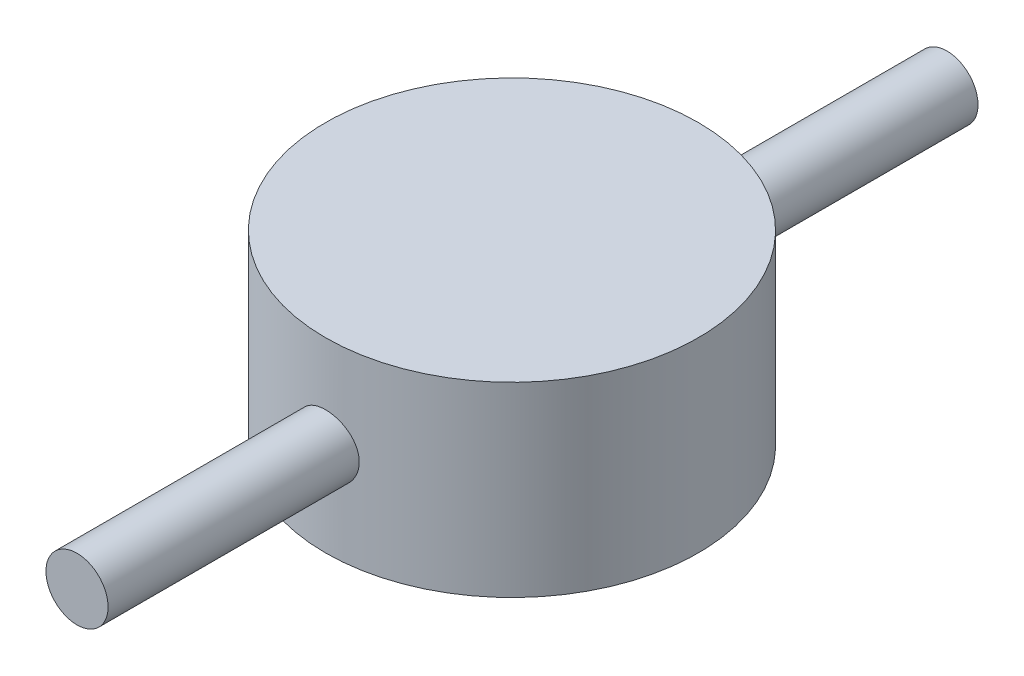
ISO-10303-21;
HEADER;
FILE_DESCRIPTION(('STEP AP214'),'2;1');
FILE_NAME('part.step','',(''),(''),'','','');
FILE_SCHEMA(('AUTOMOTIVE_DESIGN { 1 0 10303 214 1 1 1 1 }'));
ENDSEC;
DATA;
#1=APPLICATION_CONTEXT('core data for automotive mechanical design processes');
#2=APPLICATION_PROTOCOL_DEFINITION('international standard','automotive_design',2000,#1);
#3=PRODUCT_CONTEXT('',#1,'mechanical');
#4=PRODUCT('Part','Part','',(#3));
#5=PRODUCT_RELATED_PRODUCT_CATEGORY('part','',(#4));
#6=PRODUCT_DEFINITION_FORMATION('','',#4);
#7=PRODUCT_DEFINITION_CONTEXT('part definition',#1,'design');
#8=PRODUCT_DEFINITION('design','',#6,#7);
#9=PRODUCT_DEFINITION_SHAPE('','',#8);
#10=(LENGTH_UNIT() NAMED_UNIT(*) SI_UNIT(.MILLI.,.METRE.));
#11=(NAMED_UNIT(*) PLANE_ANGLE_UNIT() SI_UNIT($,.RADIAN.));
#12=(NAMED_UNIT(*) SI_UNIT($,.STERADIAN.) SOLID_ANGLE_UNIT());
#13=UNCERTAINTY_MEASURE_WITH_UNIT(LENGTH_MEASURE(1.E-05),#10,'distance_accuracy_value','');
#14=(GEOMETRIC_REPRESENTATION_CONTEXT(3) GLOBAL_UNCERTAINTY_ASSIGNED_CONTEXT((#13)) GLOBAL_UNIT_ASSIGNED_CONTEXT((#10,
#11,#12)) REPRESENTATION_CONTEXT('',''));
#15=CARTESIAN_POINT('',(0.,0.,0.));
#16=DIRECTION('',(0.,0.,1.));
#17=DIRECTION('',(1.,0.,0.));
#18=AXIS2_PLACEMENT_3D('',#15,#16,#17);
#19=CARTESIAN_POINT('',(0.,15.,0.));
#20=DIRECTION('',(0.,-1.,0.));
#21=DIRECTION('',(0.,0.,-1.));
#22=AXIS2_PLACEMENT_3D('',#19,#20,#21);
#23=CYLINDRICAL_SURFACE('',#22,15.);
#24=CARTESIAN_POINT('',(0.,9.98457309762614,-15.));
#25=CARTESIAN_POINT('',(-0.139390904958215,9.98456750867832,-14.9999976116882));
#26=CARTESIAN_POINT('',(-0.278857881838821,9.97287582265722,-14.9980367791303));
#27=CARTESIAN_POINT('',(-0.553880221673043,9.92643743886082,-14.9904034494139));
#28=CARTESIAN_POINT('',(-0.689431867959247,9.89166954071454,-14.9847275392389));
#29=CARTESIAN_POINT('',(-0.952604747212645,9.80015764903339,-14.9703006823645));
#30=CARTESIAN_POINT('',(-1.0802323684319,9.74343163198557,-14.9615522515919));
#31=CARTESIAN_POINT('',(-1.32414184197795,9.60966080557375,-14.9419422708207));
#32=CARTESIAN_POINT('',(-1.44042498987859,9.53261832014314,-14.9310809625443));
#33=CARTESIAN_POINT('',(-1.65947261429168,9.35961801380568,-14.9083331745831));
#34=CARTESIAN_POINT('',(-1.76211290353497,9.26350398299001,-14.8964387181486));
#35=CARTESIAN_POINT('',(-1.94988849865993,9.05542512915333,-14.8730262687673));
#36=CARTESIAN_POINT('',(-2.03502269939097,8.94345930616953,-14.8615082996267));
#37=CARTESIAN_POINT('',(-2.18586712560513,8.70600213142909,-14.8400756575978));
#38=CARTESIAN_POINT('',(-2.251454552861,8.58043176082139,-14.8301712909164));
#39=CARTESIAN_POINT('',(-2.36055836541122,8.31986353332552,-14.8131978979467));
#40=CARTESIAN_POINT('',(-2.40407624156561,8.18486631394851,-14.8061286801431));
#41=CARTESIAN_POINT('',(-2.46741437778481,7.9105928227696,-14.7957053684276));
#42=CARTESIAN_POINT('',(-2.4874490291354,7.77136736112475,-14.792317684857));
#43=CARTESIAN_POINT('',(-2.50391672528988,7.49149282074267,-14.7895393893665));
#44=CARTESIAN_POINT('',(-2.500351440389,7.35084384345884,-14.7901484945721));
#45=CARTESIAN_POINT('',(-2.46989509839615,7.07364523635069,-14.7952642886356));
#46=CARTESIAN_POINT('',(-2.44324488188977,6.93706829408091,-14.7997307331892));
#47=CARTESIAN_POINT('',(-2.36775314040344,6.67035177979701,-14.8119949521101));
#48=CARTESIAN_POINT('',(-2.31891085431974,6.5402124287376,-14.8197928407327));
#49=CARTESIAN_POINT('',(-2.20017724609391,6.28934427418522,-14.837884793341));
#50=CARTESIAN_POINT('',(-2.13018591387971,6.16866369154491,-14.8481906710733));
#51=CARTESIAN_POINT('',(-1.97121201755743,5.94066869708776,-14.8701291841501));
#52=CARTESIAN_POINT('',(-1.88222792065429,5.83335536517121,-14.8817619265429));
#53=CARTESIAN_POINT('',(-1.68648221215905,5.63374701181879,-14.9052202787979));
#54=CARTESIAN_POINT('',(-1.57951396387313,5.54165457908606,-14.9170464923165));
#55=CARTESIAN_POINT('',(-1.35153524898165,5.3766953349608,-14.9394260139672));
#56=CARTESIAN_POINT('',(-1.23052469190642,5.30382864744291,-14.9499793138975));
#57=CARTESIAN_POINT('',(-0.977705916166711,5.17937087048986,-14.9686389289291));
#58=CARTESIAN_POINT('',(-0.84588872556466,5.12779767829488,-14.9767431840745));
#59=CARTESIAN_POINT('',(-0.57529834560273,5.04757888238016,-14.9895750301266));
#60=CARTESIAN_POINT('',(-0.436525739179467,5.01893136065242,-14.9943029035047));
#61=CARTESIAN_POINT('',(-0.157709901301623,4.98565173916501,-14.9998112984269));
#62=CARTESIAN_POINT('',(-0.0177007371510108,4.98074152582053,-15.0006375301278));
#63=CARTESIAN_POINT('',(0.261139772889888,4.99433444205426,-14.9983747442117));
#64=CARTESIAN_POINT('',(0.399971163892039,5.01283667075988,-14.9952858772412));
#65=CARTESIAN_POINT('',(0.671656175546764,5.07249794696162,-14.985568269382));
#66=CARTESIAN_POINT('',(0.804540868385379,5.11351930601627,-14.9789610480131));
#67=CARTESIAN_POINT('',(1.06154688486044,5.21690761582567,-14.9629446445536));
#68=CARTESIAN_POINT('',(1.18566771590972,5.27927576526141,-14.9535353051202));
#69=CARTESIAN_POINT('',(1.42283068946896,5.42422422232293,-14.9328451630241));
#70=CARTESIAN_POINT('',(1.53576525093715,5.50697825379339,-14.9215485588702));
#71=CARTESIAN_POINT('',(1.74624358550269,5.6901104130112,-14.898384673919));
#72=CARTESIAN_POINT('',(1.84378623969658,5.79048982090281,-14.8865173517155));
#73=CARTESIAN_POINT('',(2.021742779658,6.00727064569756,-14.8634017523585));
#74=CARTESIAN_POINT('',(2.10196876111372,6.12382726314055,-14.8521611613711));
#75=CARTESIAN_POINT('',(2.24170231029499,6.36892606676468,-14.8317152977788));
#76=CARTESIAN_POINT('',(2.30121053476982,6.49746787285364,-14.8225099606602));
#77=CARTESIAN_POINT('',(2.39753833147315,6.76236283043827,-14.807234536977));
#78=CARTESIAN_POINT('',(2.43445143254795,6.89868119265663,-14.8011515431106));
#79=CARTESIAN_POINT('',(2.48483545377828,7.1756932268479,-14.7927771683526));
#80=CARTESIAN_POINT('',(2.49830841194617,7.3163865173582,-14.7904854578272));
#81=CARTESIAN_POINT('',(2.50137286604735,7.59627826358855,-14.7899673308401));
#82=CARTESIAN_POINT('',(2.49126013612519,7.73547347620143,-14.7916905650565));
#83=CARTESIAN_POINT('',(2.44807983895685,8.01015234567691,-14.7988978145373));
#84=CARTESIAN_POINT('',(2.41501234611248,8.14563601456801,-14.8043818176121));
#85=CARTESIAN_POINT('',(2.3269744895949,8.40893153491876,-14.8184735628172));
#86=CARTESIAN_POINT('',(2.27202959060044,8.53675210768217,-14.8270776721967));
#87=CARTESIAN_POINT('',(2.14182700391591,8.78140876682099,-14.8464436892221));
#88=CARTESIAN_POINT('',(2.06656830874856,8.89824430799828,-14.857205703884));
#89=CARTESIAN_POINT('',(1.89681888437215,9.11910868073389,-14.8798345404562));
#90=CARTESIAN_POINT('',(1.80211056359365,9.22296911432642,-14.891712955763));
#91=CARTESIAN_POINT('',(1.59660903138023,9.41342470210108,-14.9151437236084));
#92=CARTESIAN_POINT('',(1.48581211291264,9.50001586626431,-14.9266960002655));
#93=CARTESIAN_POINT('',(1.25036916964028,9.65402136582609,-14.9482652964222));
#94=CARTESIAN_POINT('',(1.12563278753282,9.72129913693909,-14.958271162531));
#95=CARTESIAN_POINT('',(0.86651306937898,9.83384258223606,-14.9755116760178));
#96=CARTESIAN_POINT('',(0.732139494830009,9.87913017870584,-14.9827490817748));
#97=CARTESIAN_POINT('',(0.4977033100454,9.93657837175281,-14.9920579083296));
#98=CARTESIAN_POINT('',(0.399058830298446,9.95454756724211,-14.9950202727336));
#99=CARTESIAN_POINT('',(0.200289310319809,9.97854683547089,-14.9989921598612));
#100=CARTESIAN_POINT('',(0.100164295608494,9.9845771137635,-15.0000017162064));
#101=CARTESIAN_POINT('',(0.,9.98457309762614,-15.));
#102=B_SPLINE_CURVE_WITH_KNOTS('',3,(#24,#25,#26,#27,#28,#29,#30,#31,#32,#33,#34,#35,#36,#37,
#38,#39,#40,#41,#42,#43,#44,#45,#46,#47,#48,#49,#50,#51,#52,#53,#54,#55,#56,#57,#58,#59,#60,#61,
#62,#63,#64,#65,#66,#67,#68,#69,#70,#71,#72,#73,#74,#75,#76,#77,#78,#79,#80,#81,#82,#83,#84,#85,
#86,#87,#88,#89,#90,#91,#92,#93,#94,#95,#96,#97,#98,#99,#100,#101),.UNSPECIFIED.,.T.,.F.,(4,2,2,
2,2,2,2,2,2,2,2,2,2,2,2,2,2,2,2,2,2,2,2,2,2,2,2,2,2,2,2,2,2,2,2,2,2,2,4),(0.,0.41780658493851,
0.835997545695421,1.25384686702527,1.67164841267479,2.09302491062332,2.51442800169857,
2.9384252082384,3.36239376876181,3.78246077103424,4.20249804320886,4.61820521760409,
5.03392665025381,5.45164556632558,5.86939820680574,6.29232769911327,6.71525991635848,
7.13854688915904,7.56179844521149,7.98007883491397,8.3983431303586,8.81407807006416,
9.22983635826067,9.64926825627024,10.0687306305428,10.4925382200762,10.9163323737594,
11.3383602234177,11.7603513778662,12.177079095227,12.5938054618813,13.0100481822622,
13.4263115502934,13.8475138419339,14.2688133387897,14.693022316072,15.1168075213007,
15.4170424816402,15.7172722727697),.UNSPECIFIED.);
#103=CARTESIAN_POINT('',(0.,9.98457309762614,-15.));
#104=VERTEX_POINT('',#103);
#105=EDGE_CURVE('E35',#104,#104,#102,.T.);
#106=ORIENTED_EDGE('',*,*,#105,.T.);
#107=EDGE_LOOP('',(#106));
#108=FACE_BOUND('',#107,.T.);
#109=CARTESIAN_POINT('',(2.5,7.48457309762614,14.790199457749));
#110=CARTESIAN_POINT('',(2.49999439841983,7.34519734946433,14.790201973666));
#111=CARTESIAN_POINT('',(2.48830516902828,7.20574549155467,14.7921909238523));
#112=CARTESIAN_POINT('',(2.44187742806638,6.93075455436297,14.7999245720004));
#113=CARTESIAN_POINT('',(2.40711766030861,6.79521920386808,14.8056727334637));
#114=CARTESIAN_POINT('',(2.31562954367049,6.53208081428453,14.8202560936731));
#115=CARTESIAN_POINT('',(2.25891955493199,6.40447124896389,14.8290887118401));
#116=CARTESIAN_POINT('',(2.12518649688947,6.16059214290837,14.8488427210228));
#117=CARTESIAN_POINT('',(2.04816571350133,6.04432132804881,14.8597638769423));
#118=CARTESIAN_POINT('',(1.87518752696654,5.82526024788158,14.8825847115588));
#119=CARTESIAN_POINT('',(1.77906904893234,5.72259796623992,14.8944921732795));
#120=CARTESIAN_POINT('',(1.57097200469527,5.53477979076433,14.9178748066858));
#121=CARTESIAN_POINT('',(1.45899249914997,5.44962493451072,14.9293499527174));
#122=CARTESIAN_POINT('',(1.22152286994836,5.29875853040687,14.9506573698271));
#123=CARTESIAN_POINT('',(1.09595608145671,5.23316608989434,14.9604794243234));
#124=CARTESIAN_POINT('',(0.835395621723868,5.12405202709559,14.9772873695709));
#125=CARTESIAN_POINT('',(0.700402564078188,5.08052896974126,14.9842734447266));
#126=CARTESIAN_POINT('',(0.426143726344242,5.01718056264224,14.994567347244));
#127=CARTESIAN_POINT('',(0.286928886679271,4.99714018162145,14.9979085311091));
#128=CARTESIAN_POINT('',(0.00707528552579717,4.98065734347354,15.0006507934278));
#129=CARTESIAN_POINT('',(-0.133563378528898,4.98421328237891,15.0000521396931));
#130=CARTESIAN_POINT('',(-0.410802185078876,5.01465444915435,14.9950085843139));
#131=CARTESIAN_POINT('',(-0.547428530700141,5.04130826103529,14.990601836924));
#132=CARTESIAN_POINT('',(-0.814241979611791,5.11682417187263,14.9784797877164));
#133=CARTESIAN_POINT('',(-0.944428886651504,5.16568694721564,14.9707643851321));
#134=CARTESIAN_POINT('',(-1.19535614778265,5.28446373794146,14.9528269851196));
#135=CARTESIAN_POINT('',(-1.31605052301904,5.35447310970858,14.9425936732688));
#136=CARTESIAN_POINT('',(-1.54406552984664,5.51348592026119,14.920757380715));
#137=CARTESIAN_POINT('',(-1.65138507791588,5.60249089633696,14.9091542891913));
#138=CARTESIAN_POINT('',(-1.85097127344667,5.79825190424545,14.885702682326));
#139=CARTESIAN_POINT('',(-1.94303950225321,5.90521019252712,14.8738528973104));
#140=CARTESIAN_POINT('',(-2.10795458844806,6.13316018784196,14.8513795978481));
#141=CARTESIAN_POINT('',(-2.18080126853242,6.25415202430896,14.8407560947132));
#142=CARTESIAN_POINT('',(-2.30524443448829,6.50696473950362,14.8219375456182));
#143=CARTESIAN_POINT('',(-2.35681702727924,6.63879759571823,14.813745233026));
#144=CARTESIAN_POINT('',(-2.43702987081562,6.90942216993369,14.8007618868988));
#145=CARTESIAN_POINT('',(-2.46567214076796,7.04821327405856,14.7959705538832));
#146=CARTESIAN_POINT('',(-2.49893188487927,7.32703925378827,14.7903895942212));
#147=CARTESIAN_POINT('',(-2.50383220791244,7.46703947732824,14.7895528575867));
#148=CARTESIAN_POINT('',(-2.49022270268246,7.74585976931696,14.7918503478236));
#149=CARTESIAN_POINT('',(-2.47171377862467,7.88467988314011,14.7949844213185));
#150=CARTESIAN_POINT('',(-2.4120523349281,8.156300856817,14.8048268745502));
#151=CARTESIAN_POINT('',(-2.37104379064639,8.28913423750415,14.8115125191835));
#152=CARTESIAN_POINT('',(-2.26769819019228,8.54604326390563,14.827685730055));
#153=CARTESIAN_POINT('',(-2.20535985810094,8.67011838517704,14.8371734639058));
#154=CARTESIAN_POINT('',(-2.06045667322923,8.90724769203225,14.8579912839739));
#155=CARTESIAN_POINT('',(-1.97771056415936,9.0201896703822,14.8693375560035));
#156=CARTESIAN_POINT('',(-1.79458946570798,9.23068663032115,14.8925466667987));
#157=CARTESIAN_POINT('',(-1.69421323638404,9.32824052873588,14.9044095418533));
#158=CARTESIAN_POINT('',(-1.47742807032881,9.50622499035484,14.9274642211826));
#159=CARTESIAN_POINT('',(-1.3608632533862,9.58646692391068,14.9386477634467));
#160=CARTESIAN_POINT('',(-1.11574344794933,9.72622842463102,14.9589511243294));
#161=CARTESIAN_POINT('',(-0.987188847470627,9.78574866209999,14.9680710096998));
#162=CARTESIAN_POINT('',(-0.722299051501328,9.88208368158101,14.9831835816958));
#163=CARTESIAN_POINT('',(-0.586000562602611,9.91899717336106,14.9891898456762));
#164=CARTESIAN_POINT('',(-0.309030734874211,9.96938869658997,14.9974558316928));
#165=CARTESIAN_POINT('',(-0.168359756821621,9.98286865635849,14.9997158620019));
#166=CARTESIAN_POINT('',(0.111541275773676,9.98595497993834,15.0002303788781));
#167=CARTESIAN_POINT('',(0.250768160602665,9.97584835156723,14.9985330202419));
#168=CARTESIAN_POINT('',(0.525511974314705,9.93266917535671,14.9914217838733));
#169=CARTESIAN_POINT('',(0.661028923967479,9.89959675611647,14.9860079269518));
#170=CARTESIAN_POINT('',(0.924396445918537,9.81153493208249,14.972069888274));
#171=CARTESIAN_POINT('',(1.05225537215382,9.75656992941609,14.9635491704088));
#172=CARTESIAN_POINT('',(1.29698045298217,9.62631516139556,14.9443275687803));
#173=CARTESIAN_POINT('',(1.41384608611822,9.55102443256369,14.9336265816741));
#174=CARTESIAN_POINT('',(1.63471294552639,9.38123800516564,14.9110762961641));
#175=CARTESIAN_POINT('',(1.73855143060275,9.28653214287489,14.8992152454112));
#176=CARTESIAN_POINT('',(1.92896387595091,9.08104478972233,14.8757630331437));
#177=CARTESIAN_POINT('',(2.0155337867119,8.97025953871361,14.8641719354951));
#178=CARTESIAN_POINT('',(2.16951427091086,8.73482777513652,14.8424834353391));
#179=CARTESIAN_POINT('',(2.2367849890577,8.61008875786066,14.8323971784578));
#180=CARTESIAN_POINT('',(2.34931453640427,8.35096386178799,14.8149921009131));
#181=CARTESIAN_POINT('',(2.39459535522307,8.21658777494878,14.8076705172488));
#182=CARTESIAN_POINT('',(2.45202605312742,7.98216932813876,14.7982474485649));
#183=CARTESIAN_POINT('',(2.46998741767139,7.88354628966353,14.7952462341947));
#184=CARTESIAN_POINT('',(2.49397629518131,7.6848196127892,14.7912213528807));
#185=CARTESIAN_POINT('',(2.50000402479277,7.58471600130194,14.7901976500369));
#186=CARTESIAN_POINT('',(2.5,7.48457309762614,14.790199457749));
#187=B_SPLINE_CURVE_WITH_KNOTS('',3,(#109,#110,#111,#112,#113,#114,#115,#116,#117,#118,#119,
#120,#121,#122,#123,#124,#125,#126,#127,#128,#129,#130,#131,#132,#133,#134,#135,#136,#137,#138,
#139,#140,#141,#142,#143,#144,#145,#146,#147,#148,#149,#150,#151,#152,#153,#154,#155,#156,#157,
#158,#159,#160,#161,#162,#163,#164,#165,#166,#167,#168,#169,#170,#171,#172,#173,#174,#175,#176,
#177,#178,#179,#180,#181,#182,#183,#184,#185,#186),.UNSPECIFIED.,.T.,.F.,(4,2,2,2,2,2,2,2,2,2,2,
2,2,2,2,2,2,2,2,2,2,2,2,2,2,2,2,2,2,2,2,2,2,2,2,2,2,2,4),(0.,0.41776103892774,0.83590751996297,
1.25370499787519,1.67145547405274,2.09289159155715,2.51435267834447,2.93832980111435,
3.36227935111113,3.78231567472565,4.20232344652692,4.61817121164668,5.03403164249533,
5.45179604139425,5.86959426226764,6.29246123462123,6.71533210746019,7.13867662498604,
7.56198385938077,7.98023542420411,8.39847083413976,8.81406064635492,9.22967532293575,
9.64912342762702,10.0686010443069,10.4924411303538,10.916267504767,11.3382298441765,
11.7601574591235,12.1769777626592,12.5937957321882,13.0101503983246,13.4265248039234,
13.8476699746325,14.2689137888181,14.6931372761832,15.1169356674445,15.4171067054377,
15.7172722940182),.UNSPECIFIED.);
#188=CARTESIAN_POINT('',(2.5,7.48457309762614,14.790199457749));
#189=VERTEX_POINT('',#188);
#190=EDGE_CURVE('E51',#189,#189,#187,.T.);
#191=ORIENTED_EDGE('',*,*,#190,.T.);
#192=EDGE_LOOP('',(#191));
#193=FACE_BOUND('',#192,.T.);
#194=CARTESIAN_POINT('',(0.,15.,0.));
#195=DIRECTION('',(0.,1.,0.));
#196=DIRECTION('',(0.,0.,1.));
#197=AXIS2_PLACEMENT_3D('',#194,#195,#196);
#198=CIRCLE('',#197,15.);
#199=CARTESIAN_POINT('',(0.,15.,15.));
#200=VERTEX_POINT('',#199);
#201=EDGE_CURVE('E10',#200,#200,#198,.T.);
#202=ORIENTED_EDGE('',*,*,#201,.F.);
#203=EDGE_LOOP('',(#202));
#204=FACE_BOUND('',#203,.T.);
#205=CARTESIAN_POINT('',(0.,0.,0.));
#206=DIRECTION('',(0.,1.,0.));
#207=DIRECTION('',(0.,0.,1.));
#208=AXIS2_PLACEMENT_3D('',#205,#206,#207);
#209=CIRCLE('',#208,15.);
#210=CARTESIAN_POINT('',(0.,0.,15.));
#211=VERTEX_POINT('',#210);
#212=EDGE_CURVE('E42',#211,#211,#209,.T.);
#213=ORIENTED_EDGE('',*,*,#212,.T.);
#214=EDGE_LOOP('',(#213));
#215=FACE_BOUND('',#214,.T.);
#216=ADVANCED_FACE('F31',(#108,#193,#204,#215),#23,.T.);
#217=CARTESIAN_POINT('',(0.,15.,0.));
#218=DIRECTION('',(0.,1.,0.));
#219=DIRECTION('',(0.,0.,1.));
#220=AXIS2_PLACEMENT_3D('',#217,#218,#219);
#221=PLANE('',#220);
#222=ORIENTED_EDGE('',*,*,#201,.T.);
#223=EDGE_LOOP('',(#222));
#224=FACE_BOUND('',#223,.T.);
#225=ADVANCED_FACE('F64',(#224),#221,.T.);
#226=CARTESIAN_POINT('',(0.,0.,0.));
#227=DIRECTION('',(0.,1.,0.));
#228=DIRECTION('',(0.,0.,1.));
#229=AXIS2_PLACEMENT_3D('',#226,#227,#228);
#230=PLANE('',#229);
#231=ORIENTED_EDGE('',*,*,#212,.F.);
#232=EDGE_LOOP('',(#231));
#233=FACE_BOUND('',#232,.T.);
#234=ADVANCED_FACE('F67',(#233),#230,.F.);
#235=CARTESIAN_POINT('',(0.,7.48457309762614,35.));
#236=DIRECTION('',(0.,0.,1.));
#237=DIRECTION('',(1.,0.,0.));
#238=AXIS2_PLACEMENT_3D('',#235,#236,#237);
#239=PLANE('',#238);
#240=CARTESIAN_POINT('',(0.,7.48457309762614,35.));
#241=DIRECTION('',(0.,0.,1.));
#242=DIRECTION('',(1.,0.,0.));
#243=AXIS2_PLACEMENT_3D('',#240,#241,#242);
#244=CIRCLE('',#243,2.5);
#245=CARTESIAN_POINT('',(2.5,7.48457309762614,35.));
#246=VERTEX_POINT('',#245);
#247=EDGE_CURVE('E93',#246,#246,#244,.T.);
#248=ORIENTED_EDGE('',*,*,#247,.T.);
#249=EDGE_LOOP('',(#248));
#250=FACE_BOUND('',#249,.T.);
#251=ADVANCED_FACE('F69',(#250),#239,.T.);
#252=CARTESIAN_POINT('',(0.,7.48457309762614,-35.));
#253=DIRECTION('',(0.,0.,1.));
#254=DIRECTION('',(1.,0.,0.));
#255=AXIS2_PLACEMENT_3D('',#252,#253,#254);
#256=CYLINDRICAL_SURFACE('',#255,2.5);
#257=ORIENTED_EDGE('',*,*,#247,.F.);
#258=EDGE_LOOP('',(#257));
#259=FACE_BOUND('',#258,.T.);
#260=ORIENTED_EDGE('',*,*,#190,.F.);
#261=EDGE_LOOP('',(#260));
#262=FACE_BOUND('',#261,.T.);
#263=ADVANCED_FACE('F61',(#259,#262),#256,.T.);
#264=CARTESIAN_POINT('',(0.,7.48457309762614,-35.));
#265=DIRECTION('',(0.,0.,1.));
#266=DIRECTION('',(1.,0.,0.));
#267=AXIS2_PLACEMENT_3D('',#264,#265,#266);
#268=CIRCLE('',#267,2.5);
#269=CARTESIAN_POINT('',(2.5,7.48457309762614,-35.));
#270=VERTEX_POINT('',#269);
#271=EDGE_CURVE('E49',#270,#270,#268,.T.);
#272=ORIENTED_EDGE('',*,*,#271,.T.);
#273=EDGE_LOOP('',(#272));
#274=FACE_BOUND('',#273,.T.);
#275=ORIENTED_EDGE('',*,*,#105,.F.);
#276=EDGE_LOOP('',(#275));
#277=FACE_BOUND('',#276,.T.);
#278=ADVANCED_FACE('F55',(#274,#277),#256,.T.);
#279=CARTESIAN_POINT('',(0.,7.48457309762614,-35.));
#280=DIRECTION('',(0.,0.,1.));
#281=DIRECTION('',(1.,0.,0.));
#282=AXIS2_PLACEMENT_3D('',#279,#280,#281);
#283=PLANE('',#282);
#284=ORIENTED_EDGE('',*,*,#271,.F.);
#285=EDGE_LOOP('',(#284));
#286=FACE_BOUND('',#285,.T.);
#287=ADVANCED_FACE('F60',(#286),#283,.F.);
#288=CLOSED_SHELL('',(#216,#225,#234,#251,#263,#278,#287));
#289=MANIFOLD_SOLID_BREP('B2',#288);
#290=ADVANCED_BREP_SHAPE_REPRESENTATION('',(#18,#289),#14);
#291=SHAPE_DEFINITION_REPRESENTATION(#9,#290);
ENDSEC;
END-ISO-10303-21;
